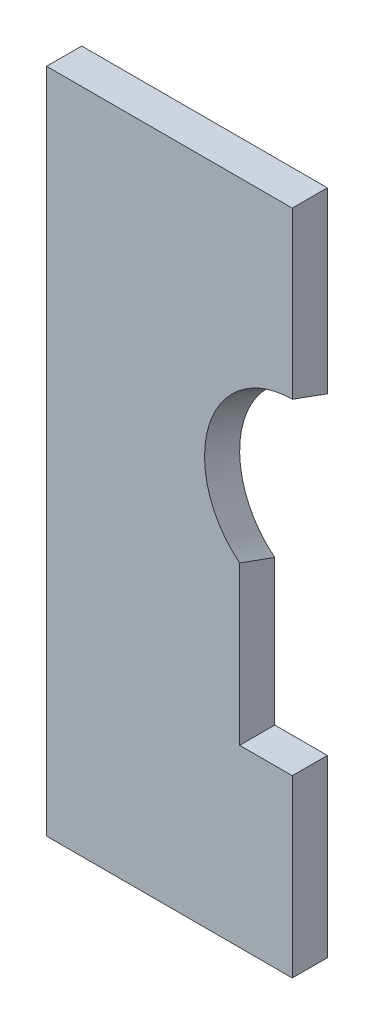
ISO-10303-21;
HEADER;
FILE_DESCRIPTION(('STEP AP214'),'2;1');
FILE_NAME('part.step','',(''),(''),'','','');
FILE_SCHEMA(('AUTOMOTIVE_DESIGN { 1 0 10303 214 1 1 1 1 }'));
ENDSEC;
DATA;
#1=APPLICATION_CONTEXT('core data for automotive mechanical design processes');
#2=APPLICATION_PROTOCOL_DEFINITION('international standard','automotive_design',2000,#1);
#3=PRODUCT_CONTEXT('',#1,'mechanical');
#4=PRODUCT('Part','Part','',(#3));
#5=PRODUCT_RELATED_PRODUCT_CATEGORY('part','',(#4));
#6=PRODUCT_DEFINITION_FORMATION('','',#4);
#7=PRODUCT_DEFINITION_CONTEXT('part definition',#1,'design');
#8=PRODUCT_DEFINITION('design','',#6,#7);
#9=PRODUCT_DEFINITION_SHAPE('','',#8);
#10=(LENGTH_UNIT() NAMED_UNIT(*) SI_UNIT(.MILLI.,.METRE.));
#11=(NAMED_UNIT(*) PLANE_ANGLE_UNIT() SI_UNIT($,.RADIAN.));
#12=(NAMED_UNIT(*) SI_UNIT($,.STERADIAN.) SOLID_ANGLE_UNIT());
#13=UNCERTAINTY_MEASURE_WITH_UNIT(LENGTH_MEASURE(1.E-05),#10,'distance_accuracy_value','');
#14=(GEOMETRIC_REPRESENTATION_CONTEXT(3) GLOBAL_UNCERTAINTY_ASSIGNED_CONTEXT((#13)) GLOBAL_UNIT_ASSIGNED_CONTEXT((#10,
#11,#12)) REPRESENTATION_CONTEXT('',''));
#15=CARTESIAN_POINT('',(0.,0.,0.));
#16=DIRECTION('',(0.,0.,1.));
#17=DIRECTION('',(1.,0.,0.));
#18=AXIS2_PLACEMENT_3D('',#15,#16,#17);
#19=CARTESIAN_POINT('',(70.,0.,10.));
#20=DIRECTION('',(-1.,0.,0.));
#21=DIRECTION('',(0.,0.,1.));
#22=AXIS2_PLACEMENT_3D('',#19,#20,#21);
#23=PLANE('',#22);
#24=DIRECTION('',(0.,1.,0.));
#25=VECTOR('',#24,1.);
#26=CARTESIAN_POINT('',(70.,0.,10.));
#27=LINE('',#26,#25);
#28=CARTESIAN_POINT('',(70.,142.811257553596,10.));
#29=VERTEX_POINT('',#28);
#30=CARTESIAN_POINT('',(70.,190.,10.));
#31=VERTEX_POINT('',#30);
#32=EDGE_CURVE('E83',#29,#31,#27,.T.);
#33=ORIENTED_EDGE('',*,*,#32,.F.);
#34=DIRECTION('',(0.,-0.342020143325669,-0.939692620785908));
#35=VECTOR('',#34,1.);
#36=CARTESIAN_POINT('',(70.,148.331291812378,25.1661694806188));
#37=LINE('',#36,#35);
#38=CARTESIAN_POINT('',(70.,139.171555210934,0.));
#39=VERTEX_POINT('',#38);
#40=EDGE_CURVE('E155',#29,#39,#37,.T.);
#41=ORIENTED_EDGE('',*,*,#40,.T.);
#42=DIRECTION('',(0.,1.,0.));
#43=VECTOR('',#42,1.);
#44=CARTESIAN_POINT('',(70.,0.,0.));
#45=LINE('',#44,#43);
#46=CARTESIAN_POINT('',(70.,190.,0.));
#47=VERTEX_POINT('',#46);
#48=EDGE_CURVE('E136',#39,#47,#45,.T.);
#49=ORIENTED_EDGE('',*,*,#48,.T.);
#50=DIRECTION('',(0.,0.,-1.));
#51=VECTOR('',#50,1.);
#52=CARTESIAN_POINT('',(70.,190.,10.));
#53=LINE('',#52,#51);
#54=EDGE_CURVE('E147',#31,#47,#53,.T.);
#55=ORIENTED_EDGE('',*,*,#54,.F.);
#56=EDGE_LOOP('',(#33,#41,#49,#55));
#57=FACE_BOUND('',#56,.T.);
#58=ADVANCED_FACE('F32',(#57),#23,.F.);
#59=CARTESIAN_POINT('',(70.,0.,0.));
#60=VERTEX_POINT('',#59);
#61=CARTESIAN_POINT('',(70.,49.9232577921803,0.));
#62=VERTEX_POINT('',#61);
#63=EDGE_CURVE('E120',#60,#62,#45,.T.);
#64=ORIENTED_EDGE('',*,*,#63,.T.);
#65=DIRECTION('',(0.,0.,-1.));
#66=VECTOR('',#65,1.);
#67=CARTESIAN_POINT('',(70.,49.9232577921803,10.));
#68=LINE('',#67,#66);
#69=CARTESIAN_POINT('',(70.,49.9232577921803,10.));
#70=VERTEX_POINT('',#69);
#71=EDGE_CURVE('E108',#70,#62,#68,.T.);
#72=ORIENTED_EDGE('',*,*,#71,.F.);
#73=CARTESIAN_POINT('',(70.,0.,10.));
#74=VERTEX_POINT('',#73);
#75=EDGE_CURVE('E118',#74,#70,#27,.T.);
#76=ORIENTED_EDGE('',*,*,#75,.F.);
#77=DIRECTION('',(0.,0.,-1.));
#78=VECTOR('',#77,1.);
#79=CARTESIAN_POINT('',(70.,0.,10.));
#80=LINE('',#79,#78);
#81=EDGE_CURVE('E133',#74,#60,#80,.T.);
#82=ORIENTED_EDGE('',*,*,#81,.T.);
#83=EDGE_LOOP('',(#64,#72,#76,#82));
#84=FACE_BOUND('',#83,.T.);
#85=ADVANCED_FACE('F34',(#84),#23,.F.);
#86=CARTESIAN_POINT('',(0.,190.,10.));
#87=DIRECTION('',(0.,-1.,0.));
#88=DIRECTION('',(0.,0.,-1.));
#89=AXIS2_PLACEMENT_3D('',#86,#87,#88);
#90=PLANE('',#89);
#91=DIRECTION('',(-1.,0.,0.));
#92=VECTOR('',#91,1.);
#93=CARTESIAN_POINT('',(0.,190.,0.));
#94=LINE('',#93,#92);
#95=CARTESIAN_POINT('',(0.,190.,0.));
#96=VERTEX_POINT('',#95);
#97=EDGE_CURVE('E135',#47,#96,#94,.T.);
#98=ORIENTED_EDGE('',*,*,#97,.T.);
#99=DIRECTION('',(0.,0.,-1.));
#100=VECTOR('',#99,1.);
#101=CARTESIAN_POINT('',(0.,190.,10.));
#102=LINE('',#101,#100);
#103=CARTESIAN_POINT('',(0.,190.,10.));
#104=VERTEX_POINT('',#103);
#105=EDGE_CURVE('E144',#104,#96,#102,.T.);
#106=ORIENTED_EDGE('',*,*,#105,.F.);
#107=DIRECTION('',(-1.,0.,0.));
#108=VECTOR('',#107,1.);
#109=CARTESIAN_POINT('',(0.,190.,10.));
#110=LINE('',#109,#108);
#111=EDGE_CURVE('E123',#31,#104,#110,.T.);
#112=ORIENTED_EDGE('',*,*,#111,.F.);
#113=ORIENTED_EDGE('',*,*,#54,.T.);
#114=EDGE_LOOP('',(#98,#106,#112,#113));
#115=FACE_BOUND('',#114,.T.);
#116=ADVANCED_FACE('F182',(#115),#90,.F.);
#117=CARTESIAN_POINT('',(0.,0.,10.));
#118=DIRECTION('',(1.,0.,0.));
#119=DIRECTION('',(0.,0.,-1.));
#120=AXIS2_PLACEMENT_3D('',#117,#118,#119);
#121=PLANE('',#120);
#122=DIRECTION('',(0.,-1.,0.));
#123=VECTOR('',#122,1.);
#124=CARTESIAN_POINT('',(0.,0.,0.));
#125=LINE('',#124,#123);
#126=CARTESIAN_POINT('',(0.,0.,0.));
#127=VERTEX_POINT('',#126);
#128=EDGE_CURVE('E138',#96,#127,#125,.T.);
#129=ORIENTED_EDGE('',*,*,#128,.T.);
#130=DIRECTION('',(0.,0.,-1.));
#131=VECTOR('',#130,1.);
#132=CARTESIAN_POINT('',(0.,0.,10.));
#133=LINE('',#132,#131);
#134=CARTESIAN_POINT('',(0.,0.,10.));
#135=VERTEX_POINT('',#134);
#136=EDGE_CURVE('E142',#135,#127,#133,.T.);
#137=ORIENTED_EDGE('',*,*,#136,.F.);
#138=DIRECTION('',(0.,-1.,0.));
#139=VECTOR('',#138,1.);
#140=CARTESIAN_POINT('',(0.,0.,10.));
#141=LINE('',#140,#139);
#142=EDGE_CURVE('E125',#104,#135,#141,.T.);
#143=ORIENTED_EDGE('',*,*,#142,.F.);
#144=ORIENTED_EDGE('',*,*,#105,.T.);
#145=EDGE_LOOP('',(#129,#137,#143,#144));
#146=FACE_BOUND('',#145,.T.);
#147=ADVANCED_FACE('F171',(#146),#121,.F.);
#148=CARTESIAN_POINT('',(0.,0.,10.));
#149=DIRECTION('',(0.,1.,0.));
#150=DIRECTION('',(0.,0.,1.));
#151=AXIS2_PLACEMENT_3D('',#148,#149,#150);
#152=PLANE('',#151);
#153=DIRECTION('',(1.,0.,0.));
#154=VECTOR('',#153,1.);
#155=CARTESIAN_POINT('',(0.,0.,0.));
#156=LINE('',#155,#154);
#157=EDGE_CURVE('E76',#127,#60,#156,.T.);
#158=ORIENTED_EDGE('',*,*,#157,.T.);
#159=ORIENTED_EDGE('',*,*,#81,.F.);
#160=DIRECTION('',(1.,0.,0.));
#161=VECTOR('',#160,1.);
#162=CARTESIAN_POINT('',(0.,0.,10.));
#163=LINE('',#162,#161);
#164=EDGE_CURVE('E55',#135,#74,#163,.T.);
#165=ORIENTED_EDGE('',*,*,#164,.F.);
#166=ORIENTED_EDGE('',*,*,#136,.T.);
#167=EDGE_LOOP('',(#158,#159,#165,#166));
#168=FACE_BOUND('',#167,.T.);
#169=ADVANCED_FACE('F174',(#168),#152,.F.);
#170=CARTESIAN_POINT('',(0.,0.,10.));
#171=DIRECTION('',(0.,0.,-1.));
#172=DIRECTION('',(-1.,0.,0.));
#173=AXIS2_PLACEMENT_3D('',#170,#171,#172);
#174=PLANE('',#173);
#175=DIRECTION('',(-1.,0.,0.));
#176=VECTOR('',#175,1.);
#177=CARTESIAN_POINT('',(70.,49.9232577921803,10.));
#178=LINE('',#177,#176);
#179=CARTESIAN_POINT('',(55.,49.9232577921803,10.));
#180=VERTEX_POINT('',#179);
#181=EDGE_CURVE('E104',#70,#180,#178,.T.);
#182=ORIENTED_EDGE('',*,*,#181,.T.);
#183=DIRECTION('',(0.,1.,0.));
#184=VECTOR('',#183,1.);
#185=CARTESIAN_POINT('',(55.,49.9232577921803,10.));
#186=LINE('',#185,#184);
#187=CARTESIAN_POINT('',(55.,94.9232577921803,10.));
#188=VERTEX_POINT('',#187);
#189=EDGE_CURVE('E113',#180,#188,#186,.T.);
#190=ORIENTED_EDGE('',*,*,#189,.T.);
#191=CARTESIAN_POINT('',(70.,116.206813241699,10.));
#192=DIRECTION('',(0.,0.,-1.));
#193=DIRECTION('',(0.,-1.,0.));
#194=AXIS2_PLACEMENT_3D('',#191,#192,#193);
#195=ELLIPSE('',#194,26.6044443118978,25.);
#196=EDGE_CURVE('E128',#188,#29,#195,.T.);
#197=ORIENTED_EDGE('',*,*,#196,.T.);
#198=ORIENTED_EDGE('',*,*,#32,.T.);
#199=ORIENTED_EDGE('',*,*,#111,.T.);
#200=ORIENTED_EDGE('',*,*,#142,.T.);
#201=ORIENTED_EDGE('',*,*,#164,.T.);
#202=ORIENTED_EDGE('',*,*,#75,.T.);
#203=EDGE_LOOP('',(#182,#190,#197,#198,#199,#200,#201,#202));
#204=FACE_BOUND('',#203,.T.);
#205=ADVANCED_FACE('F122',(#204),#174,.F.);
#206=CARTESIAN_POINT('',(0.,0.,0.));
#207=DIRECTION('',(0.,0.,-1.));
#208=DIRECTION('',(-1.,0.,0.));
#209=AXIS2_PLACEMENT_3D('',#206,#207,#208);
#210=PLANE('',#209);
#211=DIRECTION('',(0.,1.,0.));
#212=VECTOR('',#211,1.);
#213=CARTESIAN_POINT('',(55.,49.9232577921803,0.));
#214=LINE('',#213,#212);
#215=CARTESIAN_POINT('',(55.,49.9232577921803,0.));
#216=VERTEX_POINT('',#215);
#217=CARTESIAN_POINT('',(55.,91.2835554495182,0.));
#218=VERTEX_POINT('',#217);
#219=EDGE_CURVE('E47',#216,#218,#214,.T.);
#220=ORIENTED_EDGE('',*,*,#219,.F.);
#221=DIRECTION('',(-1.,0.,0.));
#222=VECTOR('',#221,1.);
#223=CARTESIAN_POINT('',(70.,49.9232577921803,0.));
#224=LINE('',#223,#222);
#225=EDGE_CURVE('E165',#62,#216,#224,.T.);
#226=ORIENTED_EDGE('',*,*,#225,.F.);
#227=ORIENTED_EDGE('',*,*,#63,.F.);
#228=ORIENTED_EDGE('',*,*,#157,.F.);
#229=ORIENTED_EDGE('',*,*,#128,.F.);
#230=ORIENTED_EDGE('',*,*,#97,.F.);
#231=ORIENTED_EDGE('',*,*,#48,.F.);
#232=CARTESIAN_POINT('',(70.,112.567110899036,0.));
#233=DIRECTION('',(0.,0.,-1.));
#234=DIRECTION('',(0.,-1.,0.));
#235=AXIS2_PLACEMENT_3D('',#232,#233,#234);
#236=ELLIPSE('',#235,26.6044443118978,25.);
#237=EDGE_CURVE('E40',#218,#39,#236,.T.);
#238=ORIENTED_EDGE('',*,*,#237,.F.);
#239=EDGE_LOOP('',(#220,#226,#227,#228,#229,#230,#231,#238));
#240=FACE_BOUND('',#239,.T.);
#241=ADVANCED_FACE('F161',(#240),#210,.T.);
#242=CARTESIAN_POINT('',(70.,124.83897629273,33.7166730637605));
#243=DIRECTION('',(0.,-0.342020143325669,-0.939692620785908));
#244=DIRECTION('',(0.,0.939692620785908,-0.342020143325669));
#245=AXIS2_PLACEMENT_3D('',#242,#243,#244);
#246=CYLINDRICAL_SURFACE('',#245,25.);
#247=ORIENTED_EDGE('',*,*,#196,.F.);
#248=DIRECTION('',(0.,-0.342020143325669,-0.939692620785908));
#249=VECTOR('',#248,1.);
#250=CARTESIAN_POINT('',(55.,106.045123877012,40.5570759302739));
#251=LINE('',#250,#249);
#252=EDGE_CURVE('E11',#188,#218,#251,.T.);
#253=ORIENTED_EDGE('',*,*,#252,.T.);
#254=ORIENTED_EDGE('',*,*,#237,.T.);
#255=ORIENTED_EDGE('',*,*,#40,.F.);
#256=EDGE_LOOP('',(#247,#253,#254,#255));
#257=FACE_BOUND('',#256,.T.);
#258=ADVANCED_FACE('F154',(#257),#246,.F.);
#259=CARTESIAN_POINT('',(55.,49.9232577921803,10.));
#260=DIRECTION('',(-1.,0.,0.));
#261=DIRECTION('',(0.,0.,1.));
#262=AXIS2_PLACEMENT_3D('',#259,#260,#261);
#263=PLANE('',#262);
#264=ORIENTED_EDGE('',*,*,#189,.F.);
#265=DIRECTION('',(0.,0.,-1.));
#266=VECTOR('',#265,1.);
#267=CARTESIAN_POINT('',(55.,49.9232577921803,10.));
#268=LINE('',#267,#266);
#269=EDGE_CURVE('E110',#180,#216,#268,.T.);
#270=ORIENTED_EDGE('',*,*,#269,.T.);
#271=ORIENTED_EDGE('',*,*,#219,.T.);
#272=ORIENTED_EDGE('',*,*,#252,.F.);
#273=EDGE_LOOP('',(#264,#270,#271,#272));
#274=FACE_BOUND('',#273,.T.);
#275=ADVANCED_FACE('F168',(#274),#263,.F.);
#276=CARTESIAN_POINT('',(70.,49.9232577921803,10.));
#277=DIRECTION('',(0.,-1.,0.));
#278=DIRECTION('',(0.,0.,-1.));
#279=AXIS2_PLACEMENT_3D('',#276,#277,#278);
#280=PLANE('',#279);
#281=ORIENTED_EDGE('',*,*,#225,.T.);
#282=ORIENTED_EDGE('',*,*,#269,.F.);
#283=ORIENTED_EDGE('',*,*,#181,.F.);
#284=ORIENTED_EDGE('',*,*,#71,.T.);
#285=EDGE_LOOP('',(#281,#282,#283,#284));
#286=FACE_BOUND('',#285,.T.);
#287=ADVANCED_FACE('F107',(#286),#280,.F.);
#288=CLOSED_SHELL('',(#58,#85,#116,#147,#169,#205,#241,#258,#275,#287));
#289=MANIFOLD_SOLID_BREP('B2',#288);
#290=ADVANCED_BREP_SHAPE_REPRESENTATION('',(#18,#289),#14);
#291=SHAPE_DEFINITION_REPRESENTATION(#9,#290);
ENDSEC;
END-ISO-10303-21;
